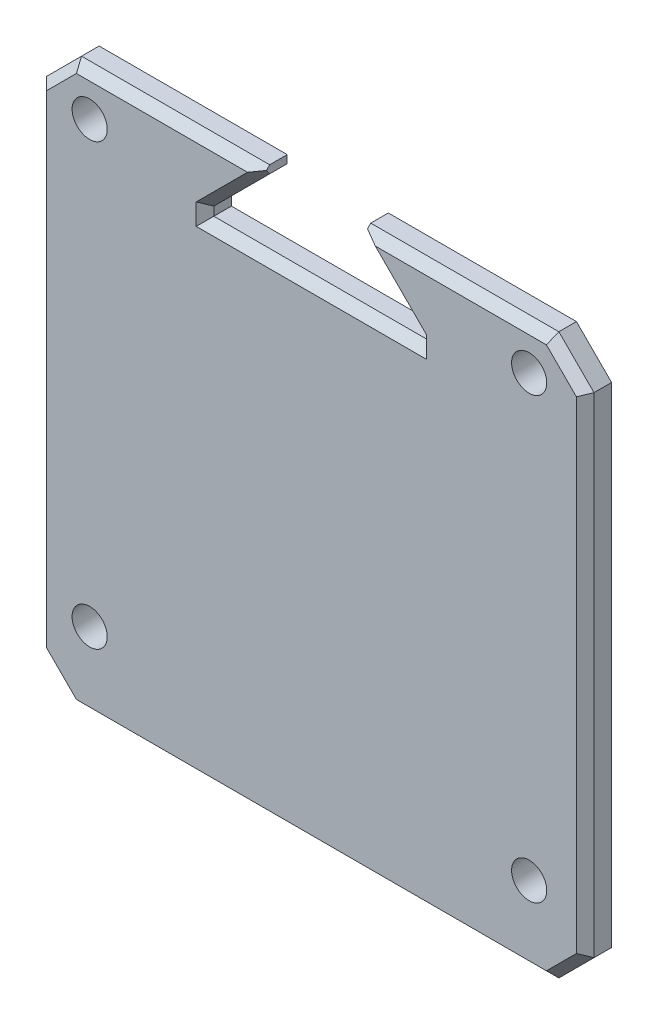
ISO-10303-21;
HEADER;
FILE_DESCRIPTION(('STEP AP214'),'2;1');
FILE_NAME('part.step','',(''),(''),'','','');
FILE_SCHEMA(('AUTOMOTIVE_DESIGN { 1 0 10303 214 1 1 1 1 }'));
ENDSEC;
DATA;
#1=APPLICATION_CONTEXT('core data for automotive mechanical design processes');
#2=APPLICATION_PROTOCOL_DEFINITION('international standard','automotive_design',2000,#1);
#3=PRODUCT_CONTEXT('',#1,'mechanical');
#4=PRODUCT('Part','Part','',(#3));
#5=PRODUCT_RELATED_PRODUCT_CATEGORY('part','',(#4));
#6=PRODUCT_DEFINITION_FORMATION('','',#4);
#7=PRODUCT_DEFINITION_CONTEXT('part definition',#1,'design');
#8=PRODUCT_DEFINITION('design','',#6,#7);
#9=PRODUCT_DEFINITION_SHAPE('','',#8);
#10=(LENGTH_UNIT() NAMED_UNIT(*) SI_UNIT(.MILLI.,.METRE.));
#11=(NAMED_UNIT(*) PLANE_ANGLE_UNIT() SI_UNIT($,.RADIAN.));
#12=(NAMED_UNIT(*) SI_UNIT($,.STERADIAN.) SOLID_ANGLE_UNIT());
#13=UNCERTAINTY_MEASURE_WITH_UNIT(LENGTH_MEASURE(1.E-05),#10,'distance_accuracy_value','');
#14=(GEOMETRIC_REPRESENTATION_CONTEXT(3) GLOBAL_UNCERTAINTY_ASSIGNED_CONTEXT((#13)) GLOBAL_UNIT_ASSIGNED_CONTEXT((#10,
#11,#12)) REPRESENTATION_CONTEXT('',''));
#15=CARTESIAN_POINT('',(0.,0.,0.));
#16=DIRECTION('',(0.,0.,1.));
#17=DIRECTION('',(1.,0.,0.));
#18=AXIS2_PLACEMENT_3D('',#15,#16,#17);
#19=CARTESIAN_POINT('',(-26.9213561857154,32.0660429498369,3.));
#20=DIRECTION('',(0.,-1.,0.));
#21=DIRECTION('',(0.,0.,-1.));
#22=AXIS2_PLACEMENT_3D('',#19,#20,#21);
#23=PLANE('',#22);
#24=DIRECTION('',(0.,0.,-1.));
#25=VECTOR('',#24,1.);
#26=CARTESIAN_POINT('',(5.97864381428452,32.0660429498369,3.));
#27=LINE('',#26,#25);
#28=CARTESIAN_POINT('',(5.97864381428452,32.0660429498369,2.));
#29=VERTEX_POINT('',#28);
#30=CARTESIAN_POINT('',(5.97864381428452,32.0660429498369,0.));
#31=VERTEX_POINT('',#30);
#32=EDGE_CURVE('E253',#29,#31,#27,.T.);
#33=ORIENTED_EDGE('',*,*,#32,.F.);
#34=DIRECTION('',(1.,0.,0.));
#35=VECTOR('',#34,1.);
#36=CARTESIAN_POINT('',(-26.9213561857154,32.0660429498369,2.));
#37=LINE('',#36,#35);
#38=CARTESIAN_POINT('',(27.3786438142846,32.0660429498369,2.));
#39=VERTEX_POINT('',#38);
#40=EDGE_CURVE('E332',#29,#39,#37,.T.);
#41=ORIENTED_EDGE('',*,*,#40,.T.);
#42=DIRECTION('',(0.,0.,-1.));
#43=VECTOR('',#42,1.);
#44=CARTESIAN_POINT('',(27.3786438142846,32.0660429498369,3.));
#45=LINE('',#44,#43);
#46=CARTESIAN_POINT('',(27.3786438142846,32.0660429498369,0.));
#47=VERTEX_POINT('',#46);
#48=EDGE_CURVE('E282',#39,#47,#45,.T.);
#49=ORIENTED_EDGE('',*,*,#48,.T.);
#50=DIRECTION('',(-1.,0.,0.));
#51=VECTOR('',#50,1.);
#52=CARTESIAN_POINT('',(-26.9213561857154,32.0660429498369,0.));
#53=LINE('',#52,#51);
#54=EDGE_CURVE('E277',#47,#31,#53,.T.);
#55=ORIENTED_EDGE('',*,*,#54,.T.);
#56=EDGE_LOOP('',(#33,#41,#49,#55));
#57=FACE_BOUND('',#56,.T.);
#58=ADVANCED_FACE('F43',(#57),#23,.F.);
#59=DIRECTION('',(0.,0.,-1.));
#60=VECTOR('',#59,1.);
#61=CARTESIAN_POINT('',(-26.9213561857154,32.0660429498369,3.));
#62=LINE('',#61,#60);
#63=CARTESIAN_POINT('',(-26.9213561857154,32.0660429498369,2.));
#64=VERTEX_POINT('',#63);
#65=CARTESIAN_POINT('',(-26.9213561857154,32.0660429498369,0.));
#66=VERTEX_POINT('',#65);
#67=EDGE_CURVE('E280',#64,#66,#62,.T.);
#68=ORIENTED_EDGE('',*,*,#67,.F.);
#69=DIRECTION('',(1.,0.,0.));
#70=VECTOR('',#69,1.);
#71=CARTESIAN_POINT('',(-26.9213561857154,32.0660429498369,2.));
#72=LINE('',#71,#70);
#73=CARTESIAN_POINT('',(-5.52135618571549,32.0660429498369,2.));
#74=VERTEX_POINT('',#73);
#75=EDGE_CURVE('E349',#64,#74,#72,.T.);
#76=ORIENTED_EDGE('',*,*,#75,.T.);
#77=DIRECTION('',(0.,0.,1.));
#78=VECTOR('',#77,1.);
#79=CARTESIAN_POINT('',(-5.52135618571549,32.0660429498369,3.));
#80=LINE('',#79,#78);
#81=CARTESIAN_POINT('',(-5.52135618571549,32.0660429498369,0.));
#82=VERTEX_POINT('',#81);
#83=EDGE_CURVE('E211',#82,#74,#80,.T.);
#84=ORIENTED_EDGE('',*,*,#83,.F.);
#85=EDGE_CURVE('E276',#82,#66,#53,.T.);
#86=ORIENTED_EDGE('',*,*,#85,.T.);
#87=EDGE_LOOP('',(#68,#76,#84,#86));
#88=FACE_BOUND('',#87,.T.);
#89=ADVANCED_FACE('F445',(#88),#23,.F.);
#90=CARTESIAN_POINT('',(0.,0.,3.));
#91=DIRECTION('',(0.,0.,-1.));
#92=DIRECTION('',(-1.,0.,0.));
#93=AXIS2_PLACEMENT_3D('',#90,#91,#92);
#94=PLANE('',#93);
#95=CARTESIAN_POINT('',(-25.,-22.6839570501632,3.));
#96=DIRECTION('',(0.,0.,1.));
#97=DIRECTION('',(-1.,0.,0.));
#98=AXIS2_PLACEMENT_3D('',#95,#96,#97);
#99=CIRCLE('',#98,2.00000000000001);
#100=CARTESIAN_POINT('',(-27.,-22.6839570501632,3.));
#101=VERTEX_POINT('',#100);
#102=EDGE_CURVE('E438',#101,#101,#99,.T.);
#103=ORIENTED_EDGE('',*,*,#102,.F.);
#104=EDGE_LOOP('',(#103));
#105=FACE_BOUND('',#104,.T.);
#106=CARTESIAN_POINT('',(25.,-22.6839570501632,3.));
#107=DIRECTION('',(0.,0.,1.));
#108=DIRECTION('',(1.,0.,0.));
#109=AXIS2_PLACEMENT_3D('',#106,#107,#108);
#110=CIRCLE('',#109,2.00000000000001);
#111=CARTESIAN_POINT('',(27.,-22.6839570501632,3.));
#112=VERTEX_POINT('',#111);
#113=EDGE_CURVE('E433',#112,#112,#110,.T.);
#114=ORIENTED_EDGE('',*,*,#113,.F.);
#115=EDGE_LOOP('',(#114));
#116=FACE_BOUND('',#115,.T.);
#117=CARTESIAN_POINT('',(25.,27.3160429498368,3.));
#118=DIRECTION('',(0.,0.,1.));
#119=DIRECTION('',(-1.,0.,0.));
#120=AXIS2_PLACEMENT_3D('',#117,#118,#119);
#121=CIRCLE('',#120,2.00000000000001);
#122=CARTESIAN_POINT('',(23.,27.3160429498368,3.));
#123=VERTEX_POINT('',#122);
#124=EDGE_CURVE('E431',#123,#123,#121,.T.);
#125=ORIENTED_EDGE('',*,*,#124,.F.);
#126=EDGE_LOOP('',(#125));
#127=FACE_BOUND('',#126,.T.);
#128=CARTESIAN_POINT('',(-25.,27.3160429498368,3.));
#129=DIRECTION('',(0.,0.,1.));
#130=DIRECTION('',(1.,0.,0.));
#131=AXIS2_PLACEMENT_3D('',#128,#129,#130);
#132=CIRCLE('',#131,2.00000000000001);
#133=CARTESIAN_POINT('',(-23.,27.3160429498368,3.));
#134=VERTEX_POINT('',#133);
#135=EDGE_CURVE('E232',#134,#134,#132,.T.);
#136=ORIENTED_EDGE('',*,*,#135,.F.);
#137=EDGE_LOOP('',(#136));
#138=FACE_BOUND('',#137,.T.);
#139=DIRECTION('',(-0.707106781186548,0.707106781186548,0.));
#140=VECTOR('',#139,1.);
#141=CARTESIAN_POINT('',(29.0152366008742,29.0152366008742,3.));
#142=LINE('',#141,#140);
#143=CARTESIAN_POINT('',(30.3786438142845,27.6518293874638,3.));
#144=VERTEX_POINT('',#143);
#145=CARTESIAN_POINT('',(26.9644302519114,31.0660429498369,3.));
#146=VERTEX_POINT('',#145);
#147=EDGE_CURVE('E323',#144,#146,#142,.T.);
#148=ORIENTED_EDGE('',*,*,#147,.T.);
#149=DIRECTION('',(-1.,0.,0.));
#150=VECTOR('',#149,1.);
#151=CARTESIAN_POINT('',(0.,31.0660429498369,3.));
#152=LINE('',#151,#150);
#153=CARTESIAN_POINT('',(7.49641076725091,31.0660429498369,3.));
#154=VERTEX_POINT('',#153);
#155=EDGE_CURVE('E325',#146,#154,#152,.T.);
#156=ORIENTED_EDGE('',*,*,#155,.T.);
#157=DIRECTION('',(0.707106781186548,-0.707106781186548,0.));
#158=VECTOR('',#157,1.);
#159=CARTESIAN_POINT('',(13.0393039860643,25.5231497310235,3.));
#160=LINE('',#159,#158);
#161=CARTESIAN_POINT('',(13.3321972048778,25.23025651221,3.));
#162=VERTEX_POINT('',#161);
#163=EDGE_CURVE('E299',#154,#162,#160,.T.);
#164=ORIENTED_EDGE('',*,*,#163,.T.);
#165=DIRECTION('',(0.,-1.,0.));
#166=VECTOR('',#165,1.);
#167=CARTESIAN_POINT('',(13.3321972048778,23.816042949837,3.));
#168=LINE('',#167,#166);
#169=CARTESIAN_POINT('',(13.3321972048778,22.8160429498369,3.));
#170=VERTEX_POINT('',#169);
#171=EDGE_CURVE('E301',#162,#170,#168,.T.);
#172=ORIENTED_EDGE('',*,*,#171,.T.);
#173=DIRECTION('',(-1.,0.,0.));
#174=VECTOR('',#173,1.);
#175=CARTESIAN_POINT('',(-11.8749095763088,22.8160429498369,3.));
#176=LINE('',#175,#174);
#177=CARTESIAN_POINT('',(-12.8749095763088,22.8160429498369,3.));
#178=VERTEX_POINT('',#177);
#179=EDGE_CURVE('E303',#170,#178,#176,.T.);
#180=ORIENTED_EDGE('',*,*,#179,.T.);
#181=DIRECTION('',(0.,1.,0.));
#182=VECTOR('',#181,1.);
#183=CARTESIAN_POINT('',(-12.8749095763088,24.816042949837,3.));
#184=LINE('',#183,#182);
#185=CARTESIAN_POINT('',(-12.8749095763088,25.2302565122101,3.));
#186=VERTEX_POINT('',#185);
#187=EDGE_CURVE('E305',#178,#186,#184,.T.);
#188=ORIENTED_EDGE('',*,*,#187,.T.);
#189=DIRECTION('',(0.707106781186547,0.707106781186548,0.));
#190=VECTOR('',#189,1.);
#191=CARTESIAN_POINT('',(-6.22846296690205,31.8767031216168,3.));
#192=LINE('',#191,#190);
#193=CARTESIAN_POINT('',(-7.03912313868193,31.0660429498369,3.));
#194=VERTEX_POINT('',#193);
#195=EDGE_CURVE('E307',#186,#194,#192,.T.);
#196=ORIENTED_EDGE('',*,*,#195,.T.);
#197=DIRECTION('',(-1.,0.,0.));
#198=VECTOR('',#197,1.);
#199=CARTESIAN_POINT('',(0.,31.0660429498369,3.));
#200=LINE('',#199,#198);
#201=CARTESIAN_POINT('',(-26.5071426233423,31.0660429498369,3.));
#202=VERTEX_POINT('',#201);
#203=EDGE_CURVE('E309',#194,#202,#200,.T.);
#204=ORIENTED_EDGE('',*,*,#203,.T.);
#205=DIRECTION('',(-0.707106781186548,-0.707106781186548,0.));
#206=VECTOR('',#205,1.);
#207=CARTESIAN_POINT('',(-28.7865927865896,28.7865927865896,3.));
#208=LINE('',#207,#206);
#209=CARTESIAN_POINT('',(-29.9213561857154,27.6518293874638,3.));
#210=VERTEX_POINT('',#209);
#211=EDGE_CURVE('E311',#202,#210,#208,.T.);
#212=ORIENTED_EDGE('',*,*,#211,.T.);
#213=DIRECTION('',(0.,-1.,0.));
#214=VECTOR('',#213,1.);
#215=CARTESIAN_POINT('',(-29.9213561857154,0.,3.));
#216=LINE('',#215,#214);
#217=CARTESIAN_POINT('',(-29.9213561857154,-27.1945417588947,3.));
#218=VERTEX_POINT('',#217);
#219=EDGE_CURVE('E313',#210,#218,#216,.T.);
#220=ORIENTED_EDGE('',*,*,#219,.T.);
#221=DIRECTION('',(0.707106781186548,-0.707106781186548,0.));
#222=VECTOR('',#221,1.);
#223=CARTESIAN_POINT('',(-28.5579489723051,-28.5579489723051,3.));
#224=LINE('',#223,#222);
#225=CARTESIAN_POINT('',(-26.5071426233423,-30.6087553212678,3.));
#226=VERTEX_POINT('',#225);
#227=EDGE_CURVE('E315',#218,#226,#224,.T.);
#228=ORIENTED_EDGE('',*,*,#227,.T.);
#229=DIRECTION('',(1.,0.,0.));
#230=VECTOR('',#229,1.);
#231=CARTESIAN_POINT('',(0.,-30.6087553212678,3.));
#232=LINE('',#231,#230);
#233=CARTESIAN_POINT('',(26.9644302519115,-30.6087553212678,3.));
#234=VERTEX_POINT('',#233);
#235=EDGE_CURVE('E317',#226,#234,#232,.T.);
#236=ORIENTED_EDGE('',*,*,#235,.T.);
#237=DIRECTION('',(0.707106781186546,0.707106781186549,0.));
#238=VECTOR('',#237,1.);
#239=CARTESIAN_POINT('',(28.7865927865897,-28.7865927865896,3.));
#240=LINE('',#239,#238);
#241=CARTESIAN_POINT('',(30.3786438142845,-27.1945417588947,3.));
#242=VERTEX_POINT('',#241);
#243=EDGE_CURVE('E319',#234,#242,#240,.T.);
#244=ORIENTED_EDGE('',*,*,#243,.T.);
#245=DIRECTION('',(0.,1.,0.));
#246=VECTOR('',#245,1.);
#247=CARTESIAN_POINT('',(30.3786438142845,0.,3.));
#248=LINE('',#247,#246);
#249=EDGE_CURVE('E321',#242,#144,#248,.T.);
#250=ORIENTED_EDGE('',*,*,#249,.T.);
#251=EDGE_LOOP('',(#148,#156,#164,#172,#180,#188,#196,#204,#212,#220,#228,#236,#244,#250));
#252=FACE_BOUND('',#251,.T.);
#253=ADVANCED_FACE('F415',(#105,#116,#127,#138,#252),#94,.F.);
#254=CARTESIAN_POINT('',(0.,0.,0.));
#255=DIRECTION('',(0.,0.,-1.));
#256=DIRECTION('',(-1.,0.,0.));
#257=AXIS2_PLACEMENT_3D('',#254,#255,#256);
#258=PLANE('',#257);
#259=CARTESIAN_POINT('',(-25.,-22.6839570501632,0.));
#260=DIRECTION('',(0.,0.,-1.));
#261=DIRECTION('',(-1.,0.,0.));
#262=AXIS2_PLACEMENT_3D('',#259,#260,#261);
#263=CIRCLE('',#262,2.00000000000001);
#264=CARTESIAN_POINT('',(-27.,-22.6839570501632,0.));
#265=VERTEX_POINT('',#264);
#266=EDGE_CURVE('E48',#265,#265,#263,.T.);
#267=ORIENTED_EDGE('',*,*,#266,.F.);
#268=EDGE_LOOP('',(#267));
#269=FACE_BOUND('',#268,.T.);
#270=CARTESIAN_POINT('',(25.,-22.6839570501632,0.));
#271=DIRECTION('',(0.,0.,-1.));
#272=DIRECTION('',(-1.,0.,0.));
#273=AXIS2_PLACEMENT_3D('',#270,#271,#272);
#274=CIRCLE('',#273,2.00000000000001);
#275=CARTESIAN_POINT('',(23.,-22.6839570501632,0.));
#276=VERTEX_POINT('',#275);
#277=EDGE_CURVE('E402',#276,#276,#274,.T.);
#278=ORIENTED_EDGE('',*,*,#277,.F.);
#279=EDGE_LOOP('',(#278));
#280=FACE_BOUND('',#279,.T.);
#281=CARTESIAN_POINT('',(25.,27.3160429498368,0.));
#282=DIRECTION('',(0.,0.,-1.));
#283=DIRECTION('',(-1.,0.,0.));
#284=AXIS2_PLACEMENT_3D('',#281,#282,#283);
#285=CIRCLE('',#284,2.00000000000001);
#286=CARTESIAN_POINT('',(23.,27.3160429498368,0.));
#287=VERTEX_POINT('',#286);
#288=EDGE_CURVE('E400',#287,#287,#285,.T.);
#289=ORIENTED_EDGE('',*,*,#288,.F.);
#290=EDGE_LOOP('',(#289));
#291=FACE_BOUND('',#290,.T.);
#292=CARTESIAN_POINT('',(-25.,27.3160429498368,0.));
#293=DIRECTION('',(0.,0.,-1.));
#294=DIRECTION('',(-1.,0.,0.));
#295=AXIS2_PLACEMENT_3D('',#292,#293,#294);
#296=CIRCLE('',#295,2.00000000000001);
#297=CARTESIAN_POINT('',(-27.,27.3160429498368,0.));
#298=VERTEX_POINT('',#297);
#299=EDGE_CURVE('E397',#298,#298,#296,.T.);
#300=ORIENTED_EDGE('',*,*,#299,.F.);
#301=EDGE_LOOP('',(#300));
#302=FACE_BOUND('',#301,.T.);
#303=DIRECTION('',(-0.707106781186548,0.707106781186548,0.));
#304=VECTOR('',#303,1.);
#305=CARTESIAN_POINT('',(18.5741200773574,18.5741200773574,0.));
#306=LINE('',#305,#304);
#307=CARTESIAN_POINT('',(12.3321972048778,24.816042949837,0.));
#308=VERTEX_POINT('',#307);
#309=CARTESIAN_POINT('',(5.97864381428452,31.1695963404302,0.));
#310=VERTEX_POINT('',#309);
#311=EDGE_CURVE('E220',#308,#310,#306,.T.);
#312=ORIENTED_EDGE('',*,*,#311,.T.);
#313=DIRECTION('',(0.,1.,0.));
#314=VECTOR('',#313,1.);
#315=CARTESIAN_POINT('',(5.97864381428452,0.,0.));
#316=LINE('',#315,#314);
#317=EDGE_CURVE('E236',#310,#31,#316,.T.);
#318=ORIENTED_EDGE('',*,*,#317,.T.);
#319=ORIENTED_EDGE('',*,*,#54,.F.);
#320=DIRECTION('',(-0.707106781186548,0.707106781186548,0.));
#321=VECTOR('',#320,1.);
#322=CARTESIAN_POINT('',(27.3786438142846,32.0660429498369,0.));
#323=LINE('',#322,#321);
#324=CARTESIAN_POINT('',(31.3786438142846,28.0660429498369,0.));
#325=VERTEX_POINT('',#324);
#326=EDGE_CURVE('E273',#325,#47,#323,.T.);
#327=ORIENTED_EDGE('',*,*,#326,.F.);
#328=DIRECTION('',(0.,1.,0.));
#329=VECTOR('',#328,1.);
#330=CARTESIAN_POINT('',(31.3786438142846,28.0660429498369,0.));
#331=LINE('',#330,#329);
#332=CARTESIAN_POINT('',(31.3786438142846,-27.6087553212678,0.));
#333=VERTEX_POINT('',#332);
#334=EDGE_CURVE('E270',#333,#325,#331,.T.);
#335=ORIENTED_EDGE('',*,*,#334,.F.);
#336=DIRECTION('',(0.707106781186546,0.707106781186549,0.));
#337=VECTOR('',#336,1.);
#338=CARTESIAN_POINT('',(27.3786438142846,-31.6087553212678,0.));
#339=LINE('',#338,#337);
#340=CARTESIAN_POINT('',(27.3786438142846,-31.6087553212678,0.));
#341=VERTEX_POINT('',#340);
#342=EDGE_CURVE('E267',#341,#333,#339,.T.);
#343=ORIENTED_EDGE('',*,*,#342,.F.);
#344=DIRECTION('',(1.,0.,0.));
#345=VECTOR('',#344,1.);
#346=CARTESIAN_POINT('',(-26.9213561857154,-31.6087553212678,0.));
#347=LINE('',#346,#345);
#348=CARTESIAN_POINT('',(-26.9213561857154,-31.6087553212678,0.));
#349=VERTEX_POINT('',#348);
#350=EDGE_CURVE('E264',#349,#341,#347,.T.);
#351=ORIENTED_EDGE('',*,*,#350,.F.);
#352=DIRECTION('',(0.707106781186548,-0.707106781186548,0.));
#353=VECTOR('',#352,1.);
#354=CARTESIAN_POINT('',(-30.9213561857154,-27.6087553212678,0.));
#355=LINE('',#354,#353);
#356=CARTESIAN_POINT('',(-30.9213561857154,-27.6087553212678,0.));
#357=VERTEX_POINT('',#356);
#358=EDGE_CURVE('E261',#357,#349,#355,.T.);
#359=ORIENTED_EDGE('',*,*,#358,.F.);
#360=DIRECTION('',(0.,-1.,0.));
#361=VECTOR('',#360,1.);
#362=CARTESIAN_POINT('',(-30.9213561857154,28.0660429498369,0.));
#363=LINE('',#362,#361);
#364=CARTESIAN_POINT('',(-30.9213561857154,28.0660429498369,0.));
#365=VERTEX_POINT('',#364);
#366=EDGE_CURVE('E258',#365,#357,#363,.T.);
#367=ORIENTED_EDGE('',*,*,#366,.F.);
#368=DIRECTION('',(-0.707106781186548,-0.707106781186548,0.));
#369=VECTOR('',#368,1.);
#370=CARTESIAN_POINT('',(-30.9213561857154,28.0660429498369,0.));
#371=LINE('',#370,#369);
#372=EDGE_CURVE('E255',#66,#365,#371,.T.);
#373=ORIENTED_EDGE('',*,*,#372,.F.);
#374=ORIENTED_EDGE('',*,*,#85,.F.);
#375=DIRECTION('',(0.,-1.,0.));
#376=VECTOR('',#375,1.);
#377=CARTESIAN_POINT('',(-5.52135618571549,0.,0.));
#378=LINE('',#377,#376);
#379=CARTESIAN_POINT('',(-5.52135618571549,31.1695963404302,0.));
#380=VERTEX_POINT('',#379);
#381=EDGE_CURVE('E296',#82,#380,#378,.T.);
#382=ORIENTED_EDGE('',*,*,#381,.T.);
#383=DIRECTION('',(-0.707106781186547,-0.707106781186548,0.));
#384=VECTOR('',#383,1.);
#385=CARTESIAN_POINT('',(-18.3454762630729,18.3454762630729,0.));
#386=LINE('',#385,#384);
#387=CARTESIAN_POINT('',(-11.8749095763088,24.816042949837,0.));
#388=VERTEX_POINT('',#387);
#389=EDGE_CURVE('E239',#380,#388,#386,.T.);
#390=ORIENTED_EDGE('',*,*,#389,.T.);
#391=DIRECTION('',(0.,-1.,0.));
#392=VECTOR('',#391,1.);
#393=CARTESIAN_POINT('',(-11.8749095763088,0.,0.));
#394=LINE('',#393,#392);
#395=CARTESIAN_POINT('',(-11.8749095763088,23.816042949837,0.));
#396=VERTEX_POINT('',#395);
#397=EDGE_CURVE('E225',#388,#396,#394,.T.);
#398=ORIENTED_EDGE('',*,*,#397,.T.);
#399=DIRECTION('',(1.,0.,0.));
#400=VECTOR('',#399,1.);
#401=CARTESIAN_POINT('',(0.,23.816042949837,0.));
#402=LINE('',#401,#400);
#403=CARTESIAN_POINT('',(12.3321972048778,23.816042949837,0.));
#404=VERTEX_POINT('',#403);
#405=EDGE_CURVE('E208',#396,#404,#402,.T.);
#406=ORIENTED_EDGE('',*,*,#405,.T.);
#407=DIRECTION('',(0.,1.,0.));
#408=VECTOR('',#407,1.);
#409=CARTESIAN_POINT('',(12.3321972048777,0.,0.));
#410=LINE('',#409,#408);
#411=EDGE_CURVE('E215',#404,#308,#410,.T.);
#412=ORIENTED_EDGE('',*,*,#411,.T.);
#413=EDGE_LOOP('',(#312,#318,#319,#327,#335,#343,#351,#359,#367,#373,#374,#382,#390,#398,#406,#412));
#414=FACE_BOUND('',#413,.T.);
#415=ADVANCED_FACE('F222',(#269,#280,#291,#302,#414),#258,.T.);
#416=CARTESIAN_POINT('',(-30.9213561857154,28.0660429498369,3.));
#417=DIRECTION('',(0.707106781186547,-0.707106781186547,0.));
#418=DIRECTION('',(0.707106781186548,0.707106781186548,0.));
#419=AXIS2_PLACEMENT_3D('',#416,#417,#418);
#420=PLANE('',#419);
#421=DIRECTION('',(0.,0.,-1.));
#422=VECTOR('',#421,1.);
#423=CARTESIAN_POINT('',(-30.9213561857154,28.0660429498369,3.));
#424=LINE('',#423,#422);
#425=CARTESIAN_POINT('',(-30.9213561857154,28.0660429498369,2.));
#426=VERTEX_POINT('',#425);
#427=EDGE_CURVE('E294',#426,#365,#424,.T.);
#428=ORIENTED_EDGE('',*,*,#427,.F.);
#429=DIRECTION('',(0.707106781186548,0.707106781186548,0.));
#430=VECTOR('',#429,1.);
#431=CARTESIAN_POINT('',(-30.9213561857154,28.0660429498369,2.));
#432=LINE('',#431,#430);
#433=EDGE_CURVE('E347',#426,#64,#432,.T.);
#434=ORIENTED_EDGE('',*,*,#433,.T.);
#435=ORIENTED_EDGE('',*,*,#67,.T.);
#436=ORIENTED_EDGE('',*,*,#372,.T.);
#437=EDGE_LOOP('',(#428,#434,#435,#436));
#438=FACE_BOUND('',#437,.T.);
#439=ADVANCED_FACE('F414',(#438),#420,.F.);
#440=CARTESIAN_POINT('',(-30.9213561857154,28.0660429498369,3.));
#441=DIRECTION('',(1.,0.,0.));
#442=DIRECTION('',(0.,1.,0.));
#443=AXIS2_PLACEMENT_3D('',#440,#441,#442);
#444=PLANE('',#443);
#445=DIRECTION('',(0.,0.,-1.));
#446=VECTOR('',#445,1.);
#447=CARTESIAN_POINT('',(-30.9213561857154,-27.6087553212678,3.));
#448=LINE('',#447,#446);
#449=CARTESIAN_POINT('',(-30.9213561857154,-27.6087553212678,2.));
#450=VERTEX_POINT('',#449);
#451=EDGE_CURVE('E292',#450,#357,#448,.T.);
#452=ORIENTED_EDGE('',*,*,#451,.F.);
#453=DIRECTION('',(0.,1.,0.));
#454=VECTOR('',#453,1.);
#455=CARTESIAN_POINT('',(-30.9213561857154,28.0660429498369,2.));
#456=LINE('',#455,#454);
#457=EDGE_CURVE('E345',#450,#426,#456,.T.);
#458=ORIENTED_EDGE('',*,*,#457,.T.);
#459=ORIENTED_EDGE('',*,*,#427,.T.);
#460=ORIENTED_EDGE('',*,*,#366,.T.);
#461=EDGE_LOOP('',(#452,#458,#459,#460));
#462=FACE_BOUND('',#461,.T.);
#463=ADVANCED_FACE('F571',(#462),#444,.F.);
#464=CARTESIAN_POINT('',(-30.9213561857154,-27.6087553212678,3.));
#465=DIRECTION('',(0.707106781186547,0.707106781186547,0.));
#466=DIRECTION('',(-0.707106781186548,0.707106781186548,0.));
#467=AXIS2_PLACEMENT_3D('',#464,#465,#466);
#468=PLANE('',#467);
#469=DIRECTION('',(0.,0.,-1.));
#470=VECTOR('',#469,1.);
#471=CARTESIAN_POINT('',(-26.9213561857154,-31.6087553212678,3.));
#472=LINE('',#471,#470);
#473=CARTESIAN_POINT('',(-26.9213561857154,-31.6087553212678,2.));
#474=VERTEX_POINT('',#473);
#475=EDGE_CURVE('E290',#474,#349,#472,.T.);
#476=ORIENTED_EDGE('',*,*,#475,.F.);
#477=DIRECTION('',(-0.707106781186548,0.707106781186548,0.));
#478=VECTOR('',#477,1.);
#479=CARTESIAN_POINT('',(-30.9213561857154,-27.6087553212678,2.));
#480=LINE('',#479,#478);
#481=EDGE_CURVE('E343',#474,#450,#480,.T.);
#482=ORIENTED_EDGE('',*,*,#481,.T.);
#483=ORIENTED_EDGE('',*,*,#451,.T.);
#484=ORIENTED_EDGE('',*,*,#358,.T.);
#485=EDGE_LOOP('',(#476,#482,#483,#484));
#486=FACE_BOUND('',#485,.T.);
#487=ADVANCED_FACE('F567',(#486),#468,.F.);
#488=CARTESIAN_POINT('',(-26.9213561857154,-31.6087553212678,3.));
#489=DIRECTION('',(0.,1.,0.));
#490=DIRECTION('',(0.,0.,1.));
#491=AXIS2_PLACEMENT_3D('',#488,#489,#490);
#492=PLANE('',#491);
#493=DIRECTION('',(0.,0.,-1.));
#494=VECTOR('',#493,1.);
#495=CARTESIAN_POINT('',(27.3786438142846,-31.6087553212678,3.));
#496=LINE('',#495,#494);
#497=CARTESIAN_POINT('',(27.3786438142846,-31.6087553212678,2.));
#498=VERTEX_POINT('',#497);
#499=EDGE_CURVE('E288',#498,#341,#496,.T.);
#500=ORIENTED_EDGE('',*,*,#499,.F.);
#501=DIRECTION('',(-1.,0.,0.));
#502=VECTOR('',#501,1.);
#503=CARTESIAN_POINT('',(-26.9213561857154,-31.6087553212678,2.));
#504=LINE('',#503,#502);
#505=EDGE_CURVE('E341',#498,#474,#504,.T.);
#506=ORIENTED_EDGE('',*,*,#505,.T.);
#507=ORIENTED_EDGE('',*,*,#475,.T.);
#508=ORIENTED_EDGE('',*,*,#350,.T.);
#509=EDGE_LOOP('',(#500,#506,#507,#508));
#510=FACE_BOUND('',#509,.T.);
#511=ADVANCED_FACE('F564',(#510),#492,.F.);
#512=CARTESIAN_POINT('',(27.3786438142846,-31.6087553212678,3.));
#513=DIRECTION('',(-0.707106781186549,0.707106781186546,0.));
#514=DIRECTION('',(-0.707106781186546,-0.707106781186549,0.));
#515=AXIS2_PLACEMENT_3D('',#512,#513,#514);
#516=PLANE('',#515);
#517=DIRECTION('',(0.,0.,-1.));
#518=VECTOR('',#517,1.);
#519=CARTESIAN_POINT('',(31.3786438142846,-27.6087553212678,3.));
#520=LINE('',#519,#518);
#521=CARTESIAN_POINT('',(31.3786438142846,-27.6087553212678,2.));
#522=VERTEX_POINT('',#521);
#523=EDGE_CURVE('E286',#522,#333,#520,.T.);
#524=ORIENTED_EDGE('',*,*,#523,.F.);
#525=DIRECTION('',(-0.707106781186546,-0.707106781186549,0.));
#526=VECTOR('',#525,1.);
#527=CARTESIAN_POINT('',(27.3786438142846,-31.6087553212678,2.));
#528=LINE('',#527,#526);
#529=EDGE_CURVE('E339',#522,#498,#528,.T.);
#530=ORIENTED_EDGE('',*,*,#529,.T.);
#531=ORIENTED_EDGE('',*,*,#499,.T.);
#532=ORIENTED_EDGE('',*,*,#342,.T.);
#533=EDGE_LOOP('',(#524,#530,#531,#532));
#534=FACE_BOUND('',#533,.T.);
#535=ADVANCED_FACE('F524',(#534),#516,.F.);
#536=CARTESIAN_POINT('',(31.3786438142846,28.0660429498369,3.));
#537=DIRECTION('',(-1.,0.,0.));
#538=DIRECTION('',(0.,0.,1.));
#539=AXIS2_PLACEMENT_3D('',#536,#537,#538);
#540=PLANE('',#539);
#541=DIRECTION('',(0.,0.,-1.));
#542=VECTOR('',#541,1.);
#543=CARTESIAN_POINT('',(31.3786438142846,28.0660429498369,3.));
#544=LINE('',#543,#542);
#545=CARTESIAN_POINT('',(31.3786438142846,28.0660429498369,2.));
#546=VERTEX_POINT('',#545);
#547=EDGE_CURVE('E284',#546,#325,#544,.T.);
#548=ORIENTED_EDGE('',*,*,#547,.F.);
#549=DIRECTION('',(0.,-1.,0.));
#550=VECTOR('',#549,1.);
#551=CARTESIAN_POINT('',(31.3786438142846,28.0660429498369,2.));
#552=LINE('',#551,#550);
#553=EDGE_CURVE('E337',#546,#522,#552,.T.);
#554=ORIENTED_EDGE('',*,*,#553,.T.);
#555=ORIENTED_EDGE('',*,*,#523,.T.);
#556=ORIENTED_EDGE('',*,*,#334,.T.);
#557=EDGE_LOOP('',(#548,#554,#555,#556));
#558=FACE_BOUND('',#557,.T.);
#559=ADVANCED_FACE('F522',(#558),#540,.F.);
#560=CARTESIAN_POINT('',(27.3786438142846,32.0660429498369,3.));
#561=DIRECTION('',(-0.707106781186547,-0.707106781186547,0.));
#562=DIRECTION('',(0.707106781186548,-0.707106781186548,0.));
#563=AXIS2_PLACEMENT_3D('',#560,#561,#562);
#564=PLANE('',#563);
#565=ORIENTED_EDGE('',*,*,#48,.F.);
#566=DIRECTION('',(0.707106781186548,-0.707106781186548,0.));
#567=VECTOR('',#566,1.);
#568=CARTESIAN_POINT('',(27.3786438142846,32.0660429498369,2.));
#569=LINE('',#568,#567);
#570=EDGE_CURVE('E335',#39,#546,#569,.T.);
#571=ORIENTED_EDGE('',*,*,#570,.T.);
#572=ORIENTED_EDGE('',*,*,#547,.T.);
#573=ORIENTED_EDGE('',*,*,#326,.T.);
#574=EDGE_LOOP('',(#565,#571,#572,#573));
#575=FACE_BOUND('',#574,.T.);
#576=ADVANCED_FACE('F533',(#575),#564,.F.);
#577=CARTESIAN_POINT('',(0.,23.816042949837,10.));
#578=DIRECTION('',(0.,1.,0.));
#579=DIRECTION('',(0.,0.,1.));
#580=AXIS2_PLACEMENT_3D('',#577,#578,#579);
#581=PLANE('',#580);
#582=DIRECTION('',(0.,0.,-1.));
#583=VECTOR('',#582,1.);
#584=CARTESIAN_POINT('',(-11.8749095763088,23.816042949837,10.));
#585=LINE('',#584,#583);
#586=CARTESIAN_POINT('',(-11.8749095763088,23.816042949837,2.));
#587=VERTEX_POINT('',#586);
#588=EDGE_CURVE('E242',#587,#396,#585,.T.);
#589=ORIENTED_EDGE('',*,*,#588,.F.);
#590=DIRECTION('',(1.,0.,0.));
#591=VECTOR('',#590,1.);
#592=CARTESIAN_POINT('',(12.3321972048778,23.816042949837,2.));
#593=LINE('',#592,#591);
#594=CARTESIAN_POINT('',(12.3321972048778,23.816042949837,2.));
#595=VERTEX_POINT('',#594);
#596=EDGE_CURVE('E68',#587,#595,#593,.T.);
#597=ORIENTED_EDGE('',*,*,#596,.T.);
#598=DIRECTION('',(0.,0.,-1.));
#599=VECTOR('',#598,1.);
#600=CARTESIAN_POINT('',(12.3321972048778,23.816042949837,10.));
#601=LINE('',#600,#599);
#602=EDGE_CURVE('E204',#595,#404,#601,.T.);
#603=ORIENTED_EDGE('',*,*,#602,.T.);
#604=ORIENTED_EDGE('',*,*,#405,.F.);
#605=EDGE_LOOP('',(#589,#597,#603,#604));
#606=FACE_BOUND('',#605,.T.);
#607=ADVANCED_FACE('F206',(#606),#581,.T.);
#608=CARTESIAN_POINT('',(12.3321972048777,0.,10.));
#609=DIRECTION('',(-1.,0.,0.));
#610=DIRECTION('',(0.,-1.,0.));
#611=AXIS2_PLACEMENT_3D('',#608,#609,#610);
#612=PLANE('',#611);
#613=ORIENTED_EDGE('',*,*,#602,.F.);
#614=DIRECTION('',(0.,1.,0.));
#615=VECTOR('',#614,1.);
#616=CARTESIAN_POINT('',(12.3321972048778,24.816042949837,2.));
#617=LINE('',#616,#615);
#618=CARTESIAN_POINT('',(12.3321972048778,24.816042949837,2.));
#619=VERTEX_POINT('',#618);
#620=EDGE_CURVE('E53',#595,#619,#617,.T.);
#621=ORIENTED_EDGE('',*,*,#620,.T.);
#622=DIRECTION('',(0.,0.,-1.));
#623=VECTOR('',#622,1.);
#624=CARTESIAN_POINT('',(12.3321972048778,24.816042949837,10.));
#625=LINE('',#624,#623);
#626=EDGE_CURVE('E212',#619,#308,#625,.T.);
#627=ORIENTED_EDGE('',*,*,#626,.T.);
#628=ORIENTED_EDGE('',*,*,#411,.F.);
#629=EDGE_LOOP('',(#613,#621,#627,#628));
#630=FACE_BOUND('',#629,.T.);
#631=ADVANCED_FACE('F216',(#630),#612,.T.);
#632=CARTESIAN_POINT('',(18.5741200773574,18.5741200773574,10.));
#633=DIRECTION('',(-0.707106781186548,-0.707106781186548,0.));
#634=DIRECTION('',(0.707106781186548,-0.707106781186548,0.));
#635=AXIS2_PLACEMENT_3D('',#632,#633,#634);
#636=PLANE('',#635);
#637=ORIENTED_EDGE('',*,*,#626,.F.);
#638=DIRECTION('',(-0.707106781186548,0.707106781186548,0.));
#639=VECTOR('',#638,1.);
#640=CARTESIAN_POINT('',(5.97864381428452,31.1695963404302,2.));
#641=LINE('',#640,#639);
#642=CARTESIAN_POINT('',(5.97864381428452,31.1695963404302,2.));
#643=VERTEX_POINT('',#642);
#644=EDGE_CURVE('E11',#619,#643,#641,.T.);
#645=ORIENTED_EDGE('',*,*,#644,.T.);
#646=DIRECTION('',(0.,0.,-1.));
#647=VECTOR('',#646,1.);
#648=CARTESIAN_POINT('',(5.97864381428452,31.1695963404302,10.));
#649=LINE('',#648,#647);
#650=EDGE_CURVE('E248',#643,#310,#649,.T.);
#651=ORIENTED_EDGE('',*,*,#650,.T.);
#652=ORIENTED_EDGE('',*,*,#311,.F.);
#653=EDGE_LOOP('',(#637,#645,#651,#652));
#654=FACE_BOUND('',#653,.T.);
#655=ADVANCED_FACE('F541',(#654),#636,.T.);
#656=CARTESIAN_POINT('',(5.97864381428452,0.,10.));
#657=DIRECTION('',(-1.,0.,0.));
#658=DIRECTION('',(0.,0.,1.));
#659=AXIS2_PLACEMENT_3D('',#656,#657,#658);
#660=PLANE('',#659);
#661=DIRECTION('',(0.,0.816496580927729,0.577350269189622));
#662=VECTOR('',#661,1.);
#663=CARTESIAN_POINT('',(5.97864381428452,14.1611016131382,-10.0268219594437));
#664=LINE('',#663,#662);
#665=CARTESIAN_POINT('',(5.97864381428452,31.6947226062773,2.37132034355964));
#666=VERTEX_POINT('',#665);
#667=EDGE_CURVE('E328',#643,#666,#664,.T.);
#668=ORIENTED_EDGE('',*,*,#667,.T.);
#669=DIRECTION('',(0.,-0.707106781186552,0.707106781186543));
#670=VECTOR('',#669,1.);
#671=CARTESIAN_POINT('',(5.97864381428452,12.0330214749182,22.0330214749184));
#672=LINE('',#671,#670);
#673=EDGE_CURVE('E330',#666,#29,#672,.F.);
#674=ORIENTED_EDGE('',*,*,#673,.T.);
#675=ORIENTED_EDGE('',*,*,#32,.T.);
#676=ORIENTED_EDGE('',*,*,#317,.F.);
#677=ORIENTED_EDGE('',*,*,#650,.F.);
#678=EDGE_LOOP('',(#668,#674,#675,#676,#677));
#679=FACE_BOUND('',#678,.T.);
#680=ADVANCED_FACE('F538',(#679),#660,.T.);
#681=CARTESIAN_POINT('',(-5.52135618571549,0.,10.));
#682=DIRECTION('',(1.,0.,0.));
#683=DIRECTION('',(0.,0.,-1.));
#684=AXIS2_PLACEMENT_3D('',#681,#682,#683);
#685=PLANE('',#684);
#686=ORIENTED_EDGE('',*,*,#83,.T.);
#687=DIRECTION('',(0.,0.707106781186552,-0.707106781186543));
#688=VECTOR('',#687,1.);
#689=CARTESIAN_POINT('',(-5.52135618571549,12.0330214749182,22.0330214749184));
#690=LINE('',#689,#688);
#691=CARTESIAN_POINT('',(-5.52135618571549,31.6947226062773,2.37132034355963));
#692=VERTEX_POINT('',#691);
#693=EDGE_CURVE('E353',#74,#692,#690,.F.);
#694=ORIENTED_EDGE('',*,*,#693,.T.);
#695=DIRECTION('',(0.,-0.816496580927732,-0.577350269189618));
#696=VECTOR('',#695,1.);
#697=CARTESIAN_POINT('',(-5.52135618571549,14.161101613138,-10.0268219594437));
#698=LINE('',#697,#696);
#699=CARTESIAN_POINT('',(-5.52135618571549,31.1695963404302,2.));
#700=VERTEX_POINT('',#699);
#701=EDGE_CURVE('E351',#692,#700,#698,.T.);
#702=ORIENTED_EDGE('',*,*,#701,.T.);
#703=DIRECTION('',(0.,0.,-1.));
#704=VECTOR('',#703,1.);
#705=CARTESIAN_POINT('',(-5.52135618571549,31.1695963404302,10.));
#706=LINE('',#705,#704);
#707=EDGE_CURVE('E246',#700,#380,#706,.T.);
#708=ORIENTED_EDGE('',*,*,#707,.T.);
#709=ORIENTED_EDGE('',*,*,#381,.F.);
#710=EDGE_LOOP('',(#686,#694,#702,#708,#709));
#711=FACE_BOUND('',#710,.T.);
#712=ADVANCED_FACE('F548',(#711),#685,.T.);
#713=CARTESIAN_POINT('',(-18.3454762630729,18.3454762630729,10.));
#714=DIRECTION('',(0.707106781186548,-0.707106781186547,0.));
#715=DIRECTION('',(0.707106781186547,0.707106781186548,0.));
#716=AXIS2_PLACEMENT_3D('',#713,#714,#715);
#717=PLANE('',#716);
#718=ORIENTED_EDGE('',*,*,#707,.F.);
#719=DIRECTION('',(-0.707106781186547,-0.707106781186548,0.));
#720=VECTOR('',#719,1.);
#721=CARTESIAN_POINT('',(-11.8749095763088,24.816042949837,2.));
#722=LINE('',#721,#720);
#723=CARTESIAN_POINT('',(-11.8749095763088,24.816042949837,2.));
#724=VERTEX_POINT('',#723);
#725=EDGE_CURVE('E355',#700,#724,#722,.T.);
#726=ORIENTED_EDGE('',*,*,#725,.T.);
#727=DIRECTION('',(0.,0.,-1.));
#728=VECTOR('',#727,1.);
#729=CARTESIAN_POINT('',(-11.8749095763088,24.816042949837,10.));
#730=LINE('',#729,#728);
#731=EDGE_CURVE('E244',#724,#388,#730,.T.);
#732=ORIENTED_EDGE('',*,*,#731,.T.);
#733=ORIENTED_EDGE('',*,*,#389,.F.);
#734=EDGE_LOOP('',(#718,#726,#732,#733));
#735=FACE_BOUND('',#734,.T.);
#736=ADVANCED_FACE('F649',(#735),#717,.T.);
#737=CARTESIAN_POINT('',(-11.8749095763088,0.,10.));
#738=DIRECTION('',(1.,0.,0.));
#739=DIRECTION('',(0.,0.,-1.));
#740=AXIS2_PLACEMENT_3D('',#737,#738,#739);
#741=PLANE('',#740);
#742=ORIENTED_EDGE('',*,*,#731,.F.);
#743=DIRECTION('',(0.,-1.,0.));
#744=VECTOR('',#743,1.);
#745=CARTESIAN_POINT('',(-11.8749095763088,23.816042949837,2.));
#746=LINE('',#745,#744);
#747=EDGE_CURVE('E357',#724,#587,#746,.T.);
#748=ORIENTED_EDGE('',*,*,#747,.T.);
#749=ORIENTED_EDGE('',*,*,#588,.T.);
#750=ORIENTED_EDGE('',*,*,#397,.F.);
#751=EDGE_LOOP('',(#742,#748,#749,#750));
#752=FACE_BOUND('',#751,.T.);
#753=ADVANCED_FACE('F645',(#752),#741,.T.);
#754=CARTESIAN_POINT('',(-28.7865927865896,28.7865927865896,3.));
#755=DIRECTION('',(0.499999999999997,-0.499999999999997,-0.707106781186552));
#756=DIRECTION('',(-0.707106781186548,-0.707106781186548,0.));
#757=AXIS2_PLACEMENT_3D('',#754,#755,#756);
#758=PLANE('',#757);
#759=DIRECTION('',(0.281084637714821,-0.678598344545852,0.678598344545842));
#760=VECTOR('',#759,1.);
#761=CARTESIAN_POINT('',(-24.4128510955399,26.0099759398531,8.05606700998373));
#762=LINE('',#761,#760);
#763=EDGE_CURVE('E229',#64,#202,#762,.T.);
#764=ORIENTED_EDGE('',*,*,#763,.F.);
#765=ORIENTED_EDGE('',*,*,#433,.F.);
#766=DIRECTION('',(0.678598344545852,-0.281084637714821,0.678598344545842));
#767=VECTOR('',#766,1.);
#768=CARTESIAN_POINT('',(-29.6152513265609,27.5250366032937,3.3061048591545));
#769=LINE('',#768,#767);
#770=EDGE_CURVE('E226',#210,#426,#769,.F.);
#771=ORIENTED_EDGE('',*,*,#770,.F.);
#772=ORIENTED_EDGE('',*,*,#211,.F.);
#773=EDGE_LOOP('',(#764,#765,#771,#772));
#774=FACE_BOUND('',#773,.T.);
#775=ADVANCED_FACE('F46',(#774),#758,.F.);
#776=CARTESIAN_POINT('',(-29.9213561857154,0.,3.));
#777=DIRECTION('',(0.707106781186542,0.,-0.707106781186552));
#778=DIRECTION('',(0.,-1.,0.));
#779=AXIS2_PLACEMENT_3D('',#776,#777,#778);
#780=PLANE('',#779);
#781=ORIENTED_EDGE('',*,*,#770,.T.);
#782=ORIENTED_EDGE('',*,*,#457,.F.);
#783=DIRECTION('',(0.678598344545851,0.281084637714826,0.678598344545841));
#784=VECTOR('',#783,1.);
#785=CARTESIAN_POINT('',(-24.7341722107179,-25.0459398059263,8.18718397499749));
#786=LINE('',#785,#784);
#787=EDGE_CURVE('E392',#218,#450,#786,.F.);
#788=ORIENTED_EDGE('',*,*,#787,.F.);
#789=ORIENTED_EDGE('',*,*,#219,.F.);
#790=EDGE_LOOP('',(#781,#782,#788,#789));
#791=FACE_BOUND('',#790,.T.);
#792=ADVANCED_FACE('F502',(#791),#780,.F.);
#793=CARTESIAN_POINT('',(0.,31.0660429498369,3.));
#794=DIRECTION('',(0.,-0.707106781186542,-0.707106781186552));
#795=DIRECTION('',(-1.,0.,0.));
#796=AXIS2_PLACEMENT_3D('',#793,#794,#795);
#797=PLANE('',#796);
#798=ORIENTED_EDGE('',*,*,#763,.T.);
#799=ORIENTED_EDGE('',*,*,#203,.F.);
#800=DIRECTION('',(0.862856209461019,0.357406744336593,-0.357406744336588));
#801=VECTOR('',#800,1.);
#802=CARTESIAN_POINT('',(-19.0714515726133,26.0820893255751,7.98395362426172));
#803=LINE('',#802,#801);
#804=EDGE_CURVE('E389',#692,#194,#803,.F.);
#805=ORIENTED_EDGE('',*,*,#804,.F.);
#806=ORIENTED_EDGE('',*,*,#693,.F.);
#807=ORIENTED_EDGE('',*,*,#75,.F.);
#808=EDGE_LOOP('',(#798,#799,#805,#806,#807));
#809=FACE_BOUND('',#808,.T.);
#810=ADVANCED_FACE('F489',(#809),#797,.F.);
#811=CARTESIAN_POINT('',(-28.5579489723051,-28.5579489723051,3.));
#812=DIRECTION('',(0.499999999999996,0.499999999999996,-0.707106781186554));
#813=DIRECTION('',(0.707106781186548,-0.707106781186548,0.));
#814=AXIS2_PLACEMENT_3D('',#811,#812,#813);
#815=PLANE('',#814);
#816=ORIENTED_EDGE('',*,*,#787,.T.);
#817=ORIENTED_EDGE('',*,*,#481,.F.);
#818=DIRECTION('',(0.281084637714826,0.678598344545851,0.678598344545841));
#819=VECTOR('',#818,1.);
#820=CARTESIAN_POINT('',(-26.2779957835879,-30.0555459129577,3.55320940831014));
#821=LINE('',#820,#819);
#822=EDGE_CURVE('E386',#226,#474,#821,.F.);
#823=ORIENTED_EDGE('',*,*,#822,.F.);
#824=ORIENTED_EDGE('',*,*,#227,.F.);
#825=EDGE_LOOP('',(#816,#817,#823,#824));
#826=FACE_BOUND('',#825,.T.);
#827=ADVANCED_FACE('F505',(#826),#815,.F.);
#828=CARTESIAN_POINT('',(-18.3454762630729,18.3454762630729,2.));
#829=DIRECTION('',(0.499999999999995,-0.499999999999995,0.707106781186555));
#830=DIRECTION('',(0.707106781186547,0.707106781186548,0.));
#831=AXIS2_PLACEMENT_3D('',#828,#829,#830);
#832=PLANE('',#831);
#833=ORIENTED_EDGE('',*,*,#804,.T.);
#834=ORIENTED_EDGE('',*,*,#195,.F.);
#835=DIRECTION('',(-0.678598344545851,0.281084637714828,0.678598344545841));
#836=VECTOR('',#835,1.);
#837=CARTESIAN_POINT('',(-13.6203588090101,25.5390316944556,3.74544923270134));
#838=LINE('',#837,#836);
#839=EDGE_CURVE('E383',#724,#186,#838,.T.);
#840=ORIENTED_EDGE('',*,*,#839,.F.);
#841=ORIENTED_EDGE('',*,*,#725,.F.);
#842=ORIENTED_EDGE('',*,*,#701,.F.);
#843=EDGE_LOOP('',(#833,#834,#840,#841,#842));
#844=FACE_BOUND('',#843,.T.);
#845=ADVANCED_FACE('F483',(#844),#832,.T.);
#846=CARTESIAN_POINT('',(0.,-30.6087553212678,3.));
#847=DIRECTION('',(0.,0.707106781186542,-0.707106781186552));
#848=DIRECTION('',(1.,0.,0.));
#849=AXIS2_PLACEMENT_3D('',#846,#847,#848);
#850=PLANE('',#849);
#851=ORIENTED_EDGE('',*,*,#822,.T.);
#852=ORIENTED_EDGE('',*,*,#505,.F.);
#853=DIRECTION('',(-0.281084637714824,0.678598344545851,0.678598344545842));
#854=VECTOR('',#853,1.);
#855=CARTESIAN_POINT('',(24.8340090808694,-25.4654636365714,8.14329168469639));
#856=LINE('',#855,#854);
#857=EDGE_CURVE('E380',#234,#498,#856,.F.);
#858=ORIENTED_EDGE('',*,*,#857,.F.);
#859=ORIENTED_EDGE('',*,*,#235,.F.);
#860=EDGE_LOOP('',(#851,#852,#858,#859));
#861=FACE_BOUND('',#860,.T.);
#862=ADVANCED_FACE('F510',(#861),#850,.F.);
#863=CARTESIAN_POINT('',(-11.8749095763088,0.,2.));
#864=DIRECTION('',(0.707106781186542,0.,0.707106781186553));
#865=DIRECTION('',(0.,1.,0.));
#866=AXIS2_PLACEMENT_3D('',#863,#864,#865);
#867=PLANE('',#866);
#868=ORIENTED_EDGE('',*,*,#839,.T.);
#869=ORIENTED_EDGE('',*,*,#187,.F.);
#870=DIRECTION('',(-0.577350269189629,-0.577350269189629,0.57735026918962));
#871=VECTOR('',#870,1.);
#872=CARTESIAN_POINT('',(-19.8135905595878,15.8773619665579,9.93868098327895));
#873=LINE('',#872,#871);
#874=EDGE_CURVE('E377',#587,#178,#873,.T.);
#875=ORIENTED_EDGE('',*,*,#874,.F.);
#876=ORIENTED_EDGE('',*,*,#747,.F.);
#877=EDGE_LOOP('',(#868,#869,#875,#876));
#878=FACE_BOUND('',#877,.T.);
#879=ADVANCED_FACE('F478',(#878),#867,.T.);
#880=CARTESIAN_POINT('',(28.7865927865897,-28.7865927865896,3.));
#881=DIRECTION('',(-0.499999999999997,0.499999999999995,-0.707106781186553));
#882=DIRECTION('',(0.707106781186546,0.707106781186549,0.));
#883=AXIS2_PLACEMENT_3D('',#880,#881,#882);
#884=PLANE('',#883);
#885=ORIENTED_EDGE('',*,*,#857,.T.);
#886=ORIENTED_EDGE('',*,*,#529,.F.);
#887=DIRECTION('',(-0.678598344545851,0.281084637714822,0.678598344545842));
#888=VECTOR('',#887,1.);
#889=CARTESIAN_POINT('',(29.9491846371779,-27.0166539432516,3.42945917710665));
#890=LINE('',#889,#888);
#891=EDGE_CURVE('E374',#242,#522,#890,.F.);
#892=ORIENTED_EDGE('',*,*,#891,.F.);
#893=ORIENTED_EDGE('',*,*,#243,.F.);
#894=EDGE_LOOP('',(#885,#886,#892,#893));
#895=FACE_BOUND('',#894,.T.);
#896=ADVANCED_FACE('F515',(#895),#884,.F.);
#897=CARTESIAN_POINT('',(0.,23.816042949837,2.));
#898=DIRECTION('',(0.,0.707106781186542,0.707106781186553));
#899=DIRECTION('',(-1.,0.,0.));
#900=AXIS2_PLACEMENT_3D('',#897,#898,#899);
#901=PLANE('',#900);
#902=ORIENTED_EDGE('',*,*,#874,.T.);
#903=ORIENTED_EDGE('',*,*,#179,.F.);
#904=DIRECTION('',(0.577350269189628,-0.577350269189629,0.57735026918962));
#905=VECTOR('',#904,1.);
#906=CARTESIAN_POINT('',(8.22146480325182,27.9267753514629,-2.1107324016259));
#907=LINE('',#906,#905);
#908=EDGE_CURVE('E371',#595,#170,#907,.T.);
#909=ORIENTED_EDGE('',*,*,#908,.F.);
#910=ORIENTED_EDGE('',*,*,#596,.F.);
#911=EDGE_LOOP('',(#902,#903,#909,#910));
#912=FACE_BOUND('',#911,.T.);
#913=ADVANCED_FACE('F473',(#912),#901,.T.);
#914=CARTESIAN_POINT('',(30.3786438142845,0.,3.));
#915=DIRECTION('',(-0.707106781186542,0.,-0.707106781186552));
#916=DIRECTION('',(0.,1.,0.));
#917=AXIS2_PLACEMENT_3D('',#914,#915,#916);
#918=PLANE('',#917);
#919=ORIENTED_EDGE('',*,*,#891,.T.);
#920=ORIENTED_EDGE('',*,*,#553,.F.);
#921=DIRECTION('',(-0.678598344545851,-0.281084637714825,0.678598344545841));
#922=VECTOR('',#921,1.);
#923=CARTESIAN_POINT('',(25.1042351645744,25.4670977912559,8.2744086497101));
#924=LINE('',#923,#922);
#925=EDGE_CURVE('E368',#144,#546,#924,.F.);
#926=ORIENTED_EDGE('',*,*,#925,.F.);
#927=ORIENTED_EDGE('',*,*,#249,.F.);
#928=EDGE_LOOP('',(#919,#920,#926,#927));
#929=FACE_BOUND('',#928,.T.);
#930=ADVANCED_FACE('F518',(#929),#918,.F.);
#931=CARTESIAN_POINT('',(12.3321972048777,0.,2.));
#932=DIRECTION('',(-0.707106781186542,0.,0.707106781186553));
#933=DIRECTION('',(0.,-1.,0.));
#934=AXIS2_PLACEMENT_3D('',#931,#932,#933);
#935=PLANE('',#934);
#936=ORIENTED_EDGE('',*,*,#908,.T.);
#937=ORIENTED_EDGE('',*,*,#171,.F.);
#938=DIRECTION('',(0.678598344545853,0.281084637714818,0.678598344545842));
#939=VECTOR('',#938,1.);
#940=CARTESIAN_POINT('',(7.59869658355769,22.8553627949847,-2.73350062132002));
#941=LINE('',#940,#939);
#942=EDGE_CURVE('E365',#619,#162,#941,.T.);
#943=ORIENTED_EDGE('',*,*,#942,.F.);
#944=ORIENTED_EDGE('',*,*,#620,.F.);
#945=EDGE_LOOP('',(#936,#937,#943,#944));
#946=FACE_BOUND('',#945,.T.);
#947=ADVANCED_FACE('F471',(#946),#935,.T.);
#948=CARTESIAN_POINT('',(29.0152366008742,29.0152366008742,3.));
#949=DIRECTION('',(-0.499999999999996,-0.499999999999996,-0.707106781186554));
#950=DIRECTION('',(-0.707106781186548,0.707106781186548,0.));
#951=AXIS2_PLACEMENT_3D('',#948,#949,#950);
#952=PLANE('',#951);
#953=ORIENTED_EDGE('',*,*,#925,.T.);
#954=ORIENTED_EDGE('',*,*,#570,.F.);
#955=DIRECTION('',(-0.281084637714825,-0.678598344545851,0.678598344545841));
#956=VECTOR('',#955,1.);
#957=CARTESIAN_POINT('',(26.735283412157,30.5128335415268,3.55320940831014));
#958=LINE('',#957,#956);
#959=EDGE_CURVE('E363',#146,#39,#958,.F.);
#960=ORIENTED_EDGE('',*,*,#959,.F.);
#961=ORIENTED_EDGE('',*,*,#147,.F.);
#962=EDGE_LOOP('',(#953,#954,#960,#961));
#963=FACE_BOUND('',#962,.T.);
#964=ADVANCED_FACE('F457',(#963),#952,.F.);
#965=CARTESIAN_POINT('',(18.5741200773574,18.5741200773574,2.));
#966=DIRECTION('',(-0.499999999999997,-0.499999999999997,0.707106781186551));
#967=DIRECTION('',(0.707106781186548,-0.707106781186548,0.));
#968=AXIS2_PLACEMENT_3D('',#965,#966,#967);
#969=PLANE('',#968);
#970=ORIENTED_EDGE('',*,*,#942,.T.);
#971=ORIENTED_EDGE('',*,*,#163,.F.);
#972=DIRECTION('',(0.862856209461018,-0.357406744336594,0.357406744336589));
#973=VECTOR('',#972,1.);
#974=CARTESIAN_POINT('',(19.2879975072957,26.1818078002116,7.88423514962523));
#975=LINE('',#974,#973);
#976=EDGE_CURVE('E361',#666,#154,#975,.T.);
#977=ORIENTED_EDGE('',*,*,#976,.F.);
#978=ORIENTED_EDGE('',*,*,#667,.F.);
#979=ORIENTED_EDGE('',*,*,#644,.F.);
#980=EDGE_LOOP('',(#970,#971,#977,#978,#979));
#981=FACE_BOUND('',#980,.T.);
#982=ADVANCED_FACE('F465',(#981),#969,.T.);
#983=CARTESIAN_POINT('',(0.,31.0660429498369,3.));
#984=DIRECTION('',(0.,-0.707106781186542,-0.707106781186552));
#985=DIRECTION('',(-1.,0.,0.));
#986=AXIS2_PLACEMENT_3D('',#983,#984,#985);
#987=PLANE('',#986);
#988=ORIENTED_EDGE('',*,*,#959,.T.);
#989=ORIENTED_EDGE('',*,*,#40,.F.);
#990=ORIENTED_EDGE('',*,*,#673,.F.);
#991=ORIENTED_EDGE('',*,*,#976,.T.);
#992=ORIENTED_EDGE('',*,*,#155,.F.);
#993=EDGE_LOOP('',(#988,#989,#990,#991,#992));
#994=FACE_BOUND('',#993,.T.);
#995=ADVANCED_FACE('F426',(#994),#987,.F.);
#996=CARTESIAN_POINT('',(-25.,27.3160429498368,-7.));
#997=DIRECTION('',(0.,0.,1.));
#998=DIRECTION('',(1.,0.,0.));
#999=AXIS2_PLACEMENT_3D('',#996,#997,#998);
#1000=CYLINDRICAL_SURFACE('',#999,2.00000000000001);
#1001=ORIENTED_EDGE('',*,*,#299,.T.);
#1002=EDGE_LOOP('',(#1001));
#1003=FACE_BOUND('',#1002,.T.);
#1004=ORIENTED_EDGE('',*,*,#135,.T.);
#1005=EDGE_LOOP('',(#1004));
#1006=FACE_BOUND('',#1005,.T.);
#1007=ADVANCED_FACE('F422',(#1003,#1006),#1000,.F.);
#1008=CARTESIAN_POINT('',(25.,27.3160429498368,-7.));
#1009=DIRECTION('',(0.,0.,1.));
#1010=DIRECTION('',(1.,0.,0.));
#1011=AXIS2_PLACEMENT_3D('',#1008,#1009,#1010);
#1012=CYLINDRICAL_SURFACE('',#1011,2.00000000000001);
#1013=ORIENTED_EDGE('',*,*,#288,.T.);
#1014=EDGE_LOOP('',(#1013));
#1015=FACE_BOUND('',#1014,.T.);
#1016=ORIENTED_EDGE('',*,*,#124,.T.);
#1017=EDGE_LOOP('',(#1016));
#1018=FACE_BOUND('',#1017,.T.);
#1019=ADVANCED_FACE('F425',(#1015,#1018),#1012,.F.);
#1020=CARTESIAN_POINT('',(25.,-22.6839570501632,-7.));
#1021=DIRECTION('',(0.,0.,1.));
#1022=DIRECTION('',(1.,0.,0.));
#1023=AXIS2_PLACEMENT_3D('',#1020,#1021,#1022);
#1024=CYLINDRICAL_SURFACE('',#1023,2.00000000000001);
#1025=ORIENTED_EDGE('',*,*,#277,.T.);
#1026=EDGE_LOOP('',(#1025));
#1027=FACE_BOUND('',#1026,.T.);
#1028=ORIENTED_EDGE('',*,*,#113,.T.);
#1029=EDGE_LOOP('',(#1028));
#1030=FACE_BOUND('',#1029,.T.);
#1031=ADVANCED_FACE('F747',(#1027,#1030),#1024,.F.);
#1032=CARTESIAN_POINT('',(-25.,-22.6839570501632,-7.));
#1033=DIRECTION('',(0.,0.,1.));
#1034=DIRECTION('',(1.,0.,0.));
#1035=AXIS2_PLACEMENT_3D('',#1032,#1033,#1034);
#1036=CYLINDRICAL_SURFACE('',#1035,2.00000000000001);
#1037=ORIENTED_EDGE('',*,*,#266,.T.);
#1038=EDGE_LOOP('',(#1037));
#1039=FACE_BOUND('',#1038,.T.);
#1040=ORIENTED_EDGE('',*,*,#102,.T.);
#1041=EDGE_LOOP('',(#1040));
#1042=FACE_BOUND('',#1041,.T.);
#1043=ADVANCED_FACE('F409',(#1039,#1042),#1036,.F.);
#1044=CLOSED_SHELL('',(#58,#89,#253,#415,#439,#463,#487,#511,#535,#559,#576,#607,#631,#655,#680,
#712,#736,#753,#775,#792,#810,#827,#845,#862,#879,#896,#913,#930,#947,#964,#982,#995,#1007,
#1019,#1031,#1043));
#1045=MANIFOLD_SOLID_BREP('B2',#1044);
#1046=ADVANCED_BREP_SHAPE_REPRESENTATION('',(#18,#1045),#14);
#1047=SHAPE_DEFINITION_REPRESENTATION(#9,#1046);
ENDSEC;
END-ISO-10303-21;
